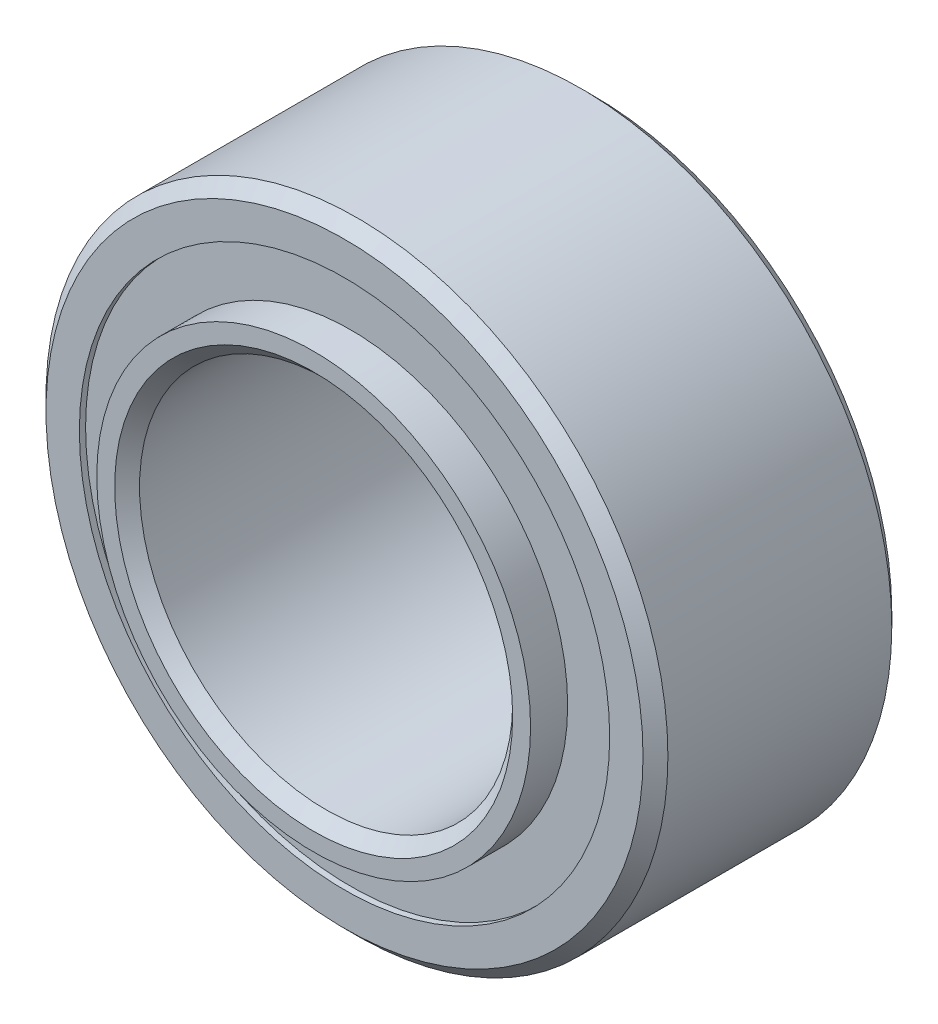
ISO-10303-21;
HEADER;
FILE_DESCRIPTION(('STEP AP214'),'2;1');
FILE_NAME('part.step','',(''),(''),'','','');
FILE_SCHEMA(('AUTOMOTIVE_DESIGN { 1 0 10303 214 1 1 1 1 }'));
ENDSEC;
DATA;
#1=APPLICATION_CONTEXT('core data for automotive mechanical design processes');
#2=APPLICATION_PROTOCOL_DEFINITION('international standard','automotive_design',2000,#1);
#3=PRODUCT_CONTEXT('',#1,'mechanical');
#4=PRODUCT('Part','Part','',(#3));
#5=PRODUCT_RELATED_PRODUCT_CATEGORY('part','',(#4));
#6=PRODUCT_DEFINITION_FORMATION('','',#4);
#7=PRODUCT_DEFINITION_CONTEXT('part definition',#1,'design');
#8=PRODUCT_DEFINITION('design','',#6,#7);
#9=PRODUCT_DEFINITION_SHAPE('','',#8);
#10=(LENGTH_UNIT() NAMED_UNIT(*) SI_UNIT(.MILLI.,.METRE.));
#11=(NAMED_UNIT(*) PLANE_ANGLE_UNIT() SI_UNIT($,.RADIAN.));
#12=(NAMED_UNIT(*) SI_UNIT($,.STERADIAN.) SOLID_ANGLE_UNIT());
#13=UNCERTAINTY_MEASURE_WITH_UNIT(LENGTH_MEASURE(1.E-05),#10,'distance_accuracy_value','');
#14=(GEOMETRIC_REPRESENTATION_CONTEXT(3) GLOBAL_UNCERTAINTY_ASSIGNED_CONTEXT((#13)) GLOBAL_UNIT_ASSIGNED_CONTEXT((#10,
#11,#12)) REPRESENTATION_CONTEXT('',''));
#15=CARTESIAN_POINT('',(0.,0.,0.));
#16=DIRECTION('',(0.,0.,1.));
#17=DIRECTION('',(1.,0.,0.));
#18=AXIS2_PLACEMENT_3D('',#15,#16,#17);
#19=CARTESIAN_POINT('',(0.,3.38434065934066,-1.508125));
#20=DIRECTION('',(0.,0.,1.));
#21=DIRECTION('',(1.,0.,0.));
#22=AXIS2_PLACEMENT_3D('',#19,#20,#21);
#23=PLANE('',#22);
#24=CARTESIAN_POINT('',(0.,0.,-1.508125));
#25=DIRECTION('',(0.,0.,1.));
#26=DIRECTION('',(1.,0.,0.));
#27=AXIS2_PLACEMENT_3D('',#24,#25,#26);
#28=CIRCLE('',#27,3.38434065934066);
#29=CARTESIAN_POINT('',(3.38434065934066,0.,-1.508125));
#30=VERTEX_POINT('',#29);
#31=EDGE_CURVE('E57',#30,#30,#28,.T.);
#32=ORIENTED_EDGE('',*,*,#31,.F.);
#33=EDGE_LOOP('',(#32));
#34=FACE_BOUND('',#33,.T.);
#35=CARTESIAN_POINT('',(0.,0.,-1.508125));
#36=DIRECTION('',(0.,0.,1.));
#37=DIRECTION('',(1.,0.,0.));
#38=AXIS2_PLACEMENT_3D('',#35,#36,#37);
#39=CIRCLE('',#38,2.7686);
#40=CARTESIAN_POINT('',(2.7686,0.,-1.508125));
#41=VERTEX_POINT('',#40);
#42=EDGE_CURVE('E11',#41,#41,#39,.T.);
#43=ORIENTED_EDGE('',*,*,#42,.T.);
#44=EDGE_LOOP('',(#43));
#45=FACE_BOUND('',#44,.T.);
#46=ADVANCED_FACE('F43',(#34,#45),#23,.F.);
#47=CARTESIAN_POINT('',(0.,0.,1.5875));
#48=DIRECTION('',(0.,0.,1.));
#49=DIRECTION('',(1.,0.,0.));
#50=AXIS2_PLACEMENT_3D('',#47,#48,#49);
#51=CYLINDRICAL_SURFACE('',#50,2.7686);
#52=ORIENTED_EDGE('',*,*,#42,.F.);
#53=EDGE_LOOP('',(#52));
#54=FACE_BOUND('',#53,.T.);
#55=CARTESIAN_POINT('',(0.,0.,-0.735956624828183));
#56=DIRECTION('',(0.,0.,1.));
#57=DIRECTION('',(1.,0.,0.));
#58=AXIS2_PLACEMENT_3D('',#55,#56,#57);
#59=CIRCLE('',#58,2.7686);
#60=CARTESIAN_POINT('',(2.7686,0.,-0.735956624828183));
#61=VERTEX_POINT('',#60);
#62=EDGE_CURVE('E49',#61,#61,#59,.T.);
#63=ORIENTED_EDGE('',*,*,#62,.T.);
#64=EDGE_LOOP('',(#63));
#65=FACE_BOUND('',#64,.T.);
#66=ADVANCED_FACE('F66',(#54,#65),#51,.F.);
#67=CARTESIAN_POINT('',(0.,3.38434065934066,-0.735956624828183));
#68=DIRECTION('',(0.,0.,-1.));
#69=DIRECTION('',(-1.,0.,0.));
#70=AXIS2_PLACEMENT_3D('',#67,#68,#69);
#71=PLANE('',#70);
#72=ORIENTED_EDGE('',*,*,#62,.F.);
#73=EDGE_LOOP('',(#72));
#74=FACE_BOUND('',#73,.T.);
#75=CARTESIAN_POINT('',(0.,0.,-0.735956624828183));
#76=DIRECTION('',(0.,0.,1.));
#77=DIRECTION('',(1.,0.,0.));
#78=AXIS2_PLACEMENT_3D('',#75,#76,#77);
#79=CIRCLE('',#78,3.38434065934066);
#80=CARTESIAN_POINT('',(3.38434065934066,0.,-0.735956624828183));
#81=VERTEX_POINT('',#80);
#82=EDGE_CURVE('E53',#81,#81,#79,.T.);
#83=ORIENTED_EDGE('',*,*,#82,.T.);
#84=EDGE_LOOP('',(#83));
#85=FACE_BOUND('',#84,.T.);
#86=ADVANCED_FACE('F70',(#74,#85),#71,.F.);
#87=CARTESIAN_POINT('',(0.,0.,1.5875));
#88=DIRECTION('',(0.,0.,1.));
#89=DIRECTION('',(1.,0.,0.));
#90=AXIS2_PLACEMENT_3D('',#87,#88,#89);
#91=CYLINDRICAL_SURFACE('',#90,3.38434065934066);
#92=ORIENTED_EDGE('',*,*,#82,.F.);
#93=EDGE_LOOP('',(#92));
#94=FACE_BOUND('',#93,.T.);
#95=ORIENTED_EDGE('',*,*,#31,.T.);
#96=EDGE_LOOP('',(#95));
#97=FACE_BOUND('',#96,.T.);
#98=ADVANCED_FACE('F63',(#94,#97),#91,.T.);
#99=CLOSED_SHELL('',(#46,#66,#86,#98));
#100=MANIFOLD_SOLID_BREP('B2',#99);
#101=CARTESIAN_POINT('',(0.,3.38434065934066,1.508125));
#102=DIRECTION('',(0.,0.,-1.));
#103=DIRECTION('',(-1.,0.,0.));
#104=AXIS2_PLACEMENT_3D('',#101,#102,#103);
#105=PLANE('',#104);
#106=CARTESIAN_POINT('',(0.,0.,1.508125));
#107=DIRECTION('',(0.,0.,1.));
#108=DIRECTION('',(1.,0.,0.));
#109=AXIS2_PLACEMENT_3D('',#106,#107,#108);
#110=CIRCLE('',#109,2.7686);
#111=CARTESIAN_POINT('',(2.7686,0.,1.508125));
#112=VERTEX_POINT('',#111);
#113=EDGE_CURVE('E42',#112,#112,#110,.T.);
#114=ORIENTED_EDGE('',*,*,#113,.F.);
#115=EDGE_LOOP('',(#114));
#116=FACE_BOUND('',#115,.T.);
#117=CARTESIAN_POINT('',(0.,0.,1.508125));
#118=DIRECTION('',(0.,0.,1.));
#119=DIRECTION('',(1.,0.,0.));
#120=AXIS2_PLACEMENT_3D('',#117,#118,#119);
#121=CIRCLE('',#120,3.38434065934066);
#122=CARTESIAN_POINT('',(3.38434065934066,0.,1.508125));
#123=VERTEX_POINT('',#122);
#124=EDGE_CURVE('E124',#123,#123,#121,.T.);
#125=ORIENTED_EDGE('',*,*,#124,.T.);
#126=EDGE_LOOP('',(#125));
#127=FACE_BOUND('',#126,.T.);
#128=ADVANCED_FACE('F110',(#116,#127),#105,.F.);
#129=CARTESIAN_POINT('',(0.,0.,1.5875));
#130=DIRECTION('',(0.,0.,1.));
#131=DIRECTION('',(1.,0.,0.));
#132=AXIS2_PLACEMENT_3D('',#129,#130,#131);
#133=CYLINDRICAL_SURFACE('',#132,2.7686);
#134=CARTESIAN_POINT('',(0.,0.,0.735956624828182));
#135=DIRECTION('',(0.,0.,1.));
#136=DIRECTION('',(1.,0.,0.));
#137=AXIS2_PLACEMENT_3D('',#134,#135,#136);
#138=CIRCLE('',#137,2.7686);
#139=CARTESIAN_POINT('',(2.7686,0.,0.735956624828182));
#140=VERTEX_POINT('',#139);
#141=EDGE_CURVE('E116',#140,#140,#138,.T.);
#142=ORIENTED_EDGE('',*,*,#141,.F.);
#143=EDGE_LOOP('',(#142));
#144=FACE_BOUND('',#143,.T.);
#145=ORIENTED_EDGE('',*,*,#113,.T.);
#146=EDGE_LOOP('',(#145));
#147=FACE_BOUND('',#146,.T.);
#148=ADVANCED_FACE('F139',(#144,#147),#133,.F.);
#149=CARTESIAN_POINT('',(0.,3.38434065934066,0.735956624828182));
#150=DIRECTION('',(0.,0.,1.));
#151=DIRECTION('',(1.,0.,0.));
#152=AXIS2_PLACEMENT_3D('',#149,#150,#151);
#153=PLANE('',#152);
#154=CARTESIAN_POINT('',(0.,0.,0.735956624828182));
#155=DIRECTION('',(0.,0.,1.));
#156=DIRECTION('',(1.,0.,0.));
#157=AXIS2_PLACEMENT_3D('',#154,#155,#156);
#158=CIRCLE('',#157,3.38434065934066);
#159=CARTESIAN_POINT('',(3.38434065934066,0.,0.735956624828182));
#160=VERTEX_POINT('',#159);
#161=EDGE_CURVE('E120',#160,#160,#158,.T.);
#162=ORIENTED_EDGE('',*,*,#161,.F.);
#163=EDGE_LOOP('',(#162));
#164=FACE_BOUND('',#163,.T.);
#165=ORIENTED_EDGE('',*,*,#141,.T.);
#166=EDGE_LOOP('',(#165));
#167=FACE_BOUND('',#166,.T.);
#168=ADVANCED_FACE('F134',(#164,#167),#153,.F.);
#169=CARTESIAN_POINT('',(0.,0.,1.5875));
#170=DIRECTION('',(0.,0.,1.));
#171=DIRECTION('',(1.,0.,0.));
#172=AXIS2_PLACEMENT_3D('',#169,#170,#171);
#173=CYLINDRICAL_SURFACE('',#172,3.38434065934066);
#174=ORIENTED_EDGE('',*,*,#124,.F.);
#175=EDGE_LOOP('',(#174));
#176=FACE_BOUND('',#175,.T.);
#177=ORIENTED_EDGE('',*,*,#161,.T.);
#178=EDGE_LOOP('',(#177));
#179=FACE_BOUND('',#178,.T.);
#180=ADVANCED_FACE('F131',(#176,#179),#173,.T.);
#181=CLOSED_SHELL('',(#128,#148,#168,#180));
#182=MANIFOLD_SOLID_BREP('B6',#181);
#183=CARTESIAN_POINT('',(-1.86621817602857,2.56862895714048,0.));
#184=DIRECTION('',(0.,0.,1.));
#185=DIRECTION('',(-0.587785252292462,0.809016994374955,0.));
#186=AXIS2_PLACEMENT_3D('',#183,#184,#185);
#187=SPHERICAL_SURFACE('',#186,0.735956624828183);
#188=CARTESIAN_POINT('',(-1.86621817602857,2.56862895714048,0.735956624828182));
#189=VERTEX_POINT('',#188);
#190=VERTEX_LOOP('',#189);
#191=FACE_BOUND('',#190,.T.);
#192=ADVANCED_FACE('F177',(#191),#187,.T.);
#193=CLOSED_SHELL('',(#192));
#194=MANIFOLD_SOLID_BREP('B37',#193);
#195=CARTESIAN_POINT('',(-3.0196044392371,0.981128957140492,0.));
#196=DIRECTION('',(0.,0.,1.));
#197=DIRECTION('',(-0.95105651629515,0.309016994374958,0.));
#198=AXIS2_PLACEMENT_3D('',#195,#196,#197);
#199=SPHERICAL_SURFACE('',#198,0.735956624828183);
#200=CARTESIAN_POINT('',(-3.0196044392371,0.981128957140492,0.735956624828182));
#201=VERTEX_POINT('',#200);
#202=VERTEX_LOOP('',#201);
#203=FACE_BOUND('',#202,.T.);
#204=ADVANCED_FACE('F197',(#203),#199,.T.);
#205=CLOSED_SHELL('',(#204));
#206=MANIFOLD_SOLID_BREP('B106',#205);
#207=CARTESIAN_POINT('',(-3.01960443923712,-0.981128957140429,0.));
#208=DIRECTION('',(0.,0.,1.));
#209=DIRECTION('',(-0.951056516295157,-0.309016994374938,0.));
#210=AXIS2_PLACEMENT_3D('',#207,#208,#209);
#211=SPHERICAL_SURFACE('',#210,0.735956624828183);
#212=CARTESIAN_POINT('',(-3.01960443923712,-0.981128957140429,0.735956624828182));
#213=VERTEX_POINT('',#212);
#214=VERTEX_LOOP('',#213);
#215=FACE_BOUND('',#214,.T.);
#216=ADVANCED_FACE('F217',(#215),#211,.T.);
#217=CLOSED_SHELL('',(#216));
#218=MANIFOLD_SOLID_BREP('B173',#217);
#219=CARTESIAN_POINT('',(-1.86621817602862,-2.56862895714044,0.));
#220=DIRECTION('',(0.,0.,1.));
#221=DIRECTION('',(-0.58778525229248,-0.809016994374942,0.));
#222=AXIS2_PLACEMENT_3D('',#219,#220,#221);
#223=SPHERICAL_SURFACE('',#222,0.735956624828183);
#224=CARTESIAN_POINT('',(-1.86621817602862,-2.56862895714044,0.735956624828182));
#225=VERTEX_POINT('',#224);
#226=VERTEX_LOOP('',#225);
#227=FACE_BOUND('',#226,.T.);
#228=ADVANCED_FACE('F237',(#227),#223,.T.);
#229=CLOSED_SHELL('',(#228));
#230=MANIFOLD_SOLID_BREP('B193',#229);
#231=CARTESIAN_POINT('',(0.,-3.175,0.));
#232=DIRECTION('',(0.,0.,1.));
#233=DIRECTION('',(0.,-1.,0.));
#234=AXIS2_PLACEMENT_3D('',#231,#232,#233);
#235=SPHERICAL_SURFACE('',#234,0.735956624828183);
#236=CARTESIAN_POINT('',(0.,-3.175,0.735956624828182));
#237=VERTEX_POINT('',#236);
#238=VERTEX_LOOP('',#237);
#239=FACE_BOUND('',#238,.T.);
#240=ADVANCED_FACE('F257',(#239),#235,.T.);
#241=CLOSED_SHELL('',(#240));
#242=MANIFOLD_SOLID_BREP('B213',#241);
#243=CARTESIAN_POINT('',(1.86621817602859,-2.56862895714047,0.));
#244=DIRECTION('',(0.,0.,1.));
#245=DIRECTION('',(0.587785252292469,-0.809016994374951,0.));
#246=AXIS2_PLACEMENT_3D('',#243,#244,#245);
#247=SPHERICAL_SURFACE('',#246,0.735956624828183);
#248=CARTESIAN_POINT('',(1.86621817602859,-2.56862895714047,0.735956624828182));
#249=VERTEX_POINT('',#248);
#250=VERTEX_LOOP('',#249);
#251=FACE_BOUND('',#250,.T.);
#252=ADVANCED_FACE('F277',(#251),#247,.T.);
#253=CLOSED_SHELL('',(#252));
#254=MANIFOLD_SOLID_BREP('B233',#253);
#255=CARTESIAN_POINT('',(3.01960443923711,-0.981128957140471,0.));
#256=DIRECTION('',(0.,0.,1.));
#257=DIRECTION('',(0.951056516295152,-0.309016994374952,0.));
#258=AXIS2_PLACEMENT_3D('',#255,#256,#257);
#259=SPHERICAL_SURFACE('',#258,0.735956624828183);
#260=CARTESIAN_POINT('',(3.01960443923711,-0.981128957140471,0.735956624828182));
#261=VERTEX_POINT('',#260);
#262=VERTEX_LOOP('',#261);
#263=FACE_BOUND('',#262,.T.);
#264=ADVANCED_FACE('F297',(#263),#259,.T.);
#265=CLOSED_SHELL('',(#264));
#266=MANIFOLD_SOLID_BREP('B253',#265);
#267=CARTESIAN_POINT('',(3.01960443923712,0.98112895714045,0.));
#268=DIRECTION('',(0.,0.,1.));
#269=DIRECTION('',(0.951056516295155,0.309016994374945,0.));
#270=AXIS2_PLACEMENT_3D('',#267,#268,#269);
#271=SPHERICAL_SURFACE('',#270,0.735956624828183);
#272=CARTESIAN_POINT('',(3.01960443923712,0.98112895714045,0.735956624828182));
#273=VERTEX_POINT('',#272);
#274=VERTEX_LOOP('',#273);
#275=FACE_BOUND('',#274,.T.);
#276=ADVANCED_FACE('F317',(#275),#271,.T.);
#277=CLOSED_SHELL('',(#276));
#278=MANIFOLD_SOLID_BREP('B273',#277);
#279=CARTESIAN_POINT('',(1.86621817602861,2.56862895714046,0.));
#280=DIRECTION('',(0.,0.,1.));
#281=DIRECTION('',(0.587785252292474,0.809016994374947,0.));
#282=AXIS2_PLACEMENT_3D('',#279,#280,#281);
#283=SPHERICAL_SURFACE('',#282,0.735956624828183);
#284=CARTESIAN_POINT('',(1.86621817602861,2.56862895714046,0.735956624828182));
#285=VERTEX_POINT('',#284);
#286=VERTEX_LOOP('',#285);
#287=FACE_BOUND('',#286,.T.);
#288=ADVANCED_FACE('F337',(#287),#283,.T.);
#289=CLOSED_SHELL('',(#288));
#290=MANIFOLD_SOLID_BREP('B293',#289);
#291=CARTESIAN_POINT('',(0.,3.175,0.));
#292=DIRECTION('',(0.,0.,1.));
#293=DIRECTION('',(0.,1.,0.));
#294=AXIS2_PLACEMENT_3D('',#291,#292,#293);
#295=SPHERICAL_SURFACE('',#294,0.735956624828183);
#296=CARTESIAN_POINT('',(0.,3.175,0.735956624828182));
#297=VERTEX_POINT('',#296);
#298=VERTEX_LOOP('',#297);
#299=FACE_BOUND('',#298,.T.);
#300=ADVANCED_FACE('F359',(#299),#295,.T.);
#301=CLOSED_SHELL('',(#300));
#302=MANIFOLD_SOLID_BREP('B313',#301);
#303=CARTESIAN_POINT('',(0.,0.,1.9812));
#304=DIRECTION('',(0.,0.,1.));
#305=DIRECTION('',(1.,0.,0.));
#306=AXIS2_PLACEMENT_3D('',#303,#304,#305);
#307=CONICAL_SURFACE('',#306,2.54,0.785398163397436);
#308=CARTESIAN_POINT('',(0.,0.,1.82245));
#309=DIRECTION('',(0.,0.,1.));
#310=DIRECTION('',(1.,0.,0.));
#311=AXIS2_PLACEMENT_3D('',#308,#309,#310);
#312=CIRCLE('',#311,2.38125);
#313=CARTESIAN_POINT('',(2.38125,0.,1.82245));
#314=VERTEX_POINT('',#313);
#315=EDGE_CURVE('E358',#314,#314,#312,.T.);
#316=ORIENTED_EDGE('',*,*,#315,.F.);
#317=EDGE_LOOP('',(#316));
#318=FACE_BOUND('',#317,.T.);
#319=CARTESIAN_POINT('',(0.,0.,1.9812));
#320=DIRECTION('',(0.,0.,1.));
#321=DIRECTION('',(1.,0.,0.));
#322=AXIS2_PLACEMENT_3D('',#319,#320,#321);
#323=CIRCLE('',#322,2.54);
#324=CARTESIAN_POINT('',(2.54,0.,1.9812));
#325=VERTEX_POINT('',#324);
#326=EDGE_CURVE('E400',#325,#325,#323,.T.);
#327=ORIENTED_EDGE('',*,*,#326,.T.);
#328=EDGE_LOOP('',(#327));
#329=FACE_BOUND('',#328,.T.);
#330=ADVANCED_FACE('F378',(#318,#329),#307,.F.);
#331=CARTESIAN_POINT('',(0.,0.,1.5875));
#332=DIRECTION('',(0.,0.,1.));
#333=DIRECTION('',(1.,0.,0.));
#334=AXIS2_PLACEMENT_3D('',#331,#332,#333);
#335=CYLINDRICAL_SURFACE('',#334,2.38125);
#336=CARTESIAN_POINT('',(0.,0.,-1.82245));
#337=DIRECTION('',(0.,0.,1.));
#338=DIRECTION('',(1.,0.,0.));
#339=AXIS2_PLACEMENT_3D('',#336,#337,#338);
#340=CIRCLE('',#339,2.38125);
#341=CARTESIAN_POINT('',(2.38125,0.,-1.82245));
#342=VERTEX_POINT('',#341);
#343=EDGE_CURVE('E384',#342,#342,#340,.T.);
#344=ORIENTED_EDGE('',*,*,#343,.F.);
#345=EDGE_LOOP('',(#344));
#346=FACE_BOUND('',#345,.T.);
#347=ORIENTED_EDGE('',*,*,#315,.T.);
#348=EDGE_LOOP('',(#347));
#349=FACE_BOUND('',#348,.T.);
#350=ADVANCED_FACE('F425',(#346,#349),#335,.F.);
#351=CARTESIAN_POINT('',(0.,0.,-1.82245));
#352=DIRECTION('',(0.,0.,-1.));
#353=DIRECTION('',(-1.,0.,0.));
#354=AXIS2_PLACEMENT_3D('',#351,#352,#353);
#355=CONICAL_SURFACE('',#354,2.38125,0.785398163397447);
#356=CARTESIAN_POINT('',(0.,0.,-1.9812));
#357=DIRECTION('',(0.,0.,1.));
#358=DIRECTION('',(1.,0.,0.));
#359=AXIS2_PLACEMENT_3D('',#356,#357,#358);
#360=CIRCLE('',#359,2.54);
#361=CARTESIAN_POINT('',(2.54,0.,-1.9812));
#362=VERTEX_POINT('',#361);
#363=EDGE_CURVE('E388',#362,#362,#360,.T.);
#364=ORIENTED_EDGE('',*,*,#363,.F.);
#365=EDGE_LOOP('',(#364));
#366=FACE_BOUND('',#365,.T.);
#367=ORIENTED_EDGE('',*,*,#343,.T.);
#368=EDGE_LOOP('',(#367));
#369=FACE_BOUND('',#368,.T.);
#370=ADVANCED_FACE('F420',(#366,#369),#355,.F.);
#371=CARTESIAN_POINT('',(0.,2.7686,-1.9812));
#372=DIRECTION('',(0.,0.,1.));
#373=DIRECTION('',(1.,0.,0.));
#374=AXIS2_PLACEMENT_3D('',#371,#372,#373);
#375=PLANE('',#374);
#376=CARTESIAN_POINT('',(0.,0.,-1.9812));
#377=DIRECTION('',(0.,0.,1.));
#378=DIRECTION('',(1.,0.,0.));
#379=AXIS2_PLACEMENT_3D('',#376,#377,#378);
#380=CIRCLE('',#379,2.7686);
#381=CARTESIAN_POINT('',(2.7686,0.,-1.9812));
#382=VERTEX_POINT('',#381);
#383=EDGE_CURVE('E392',#382,#382,#380,.T.);
#384=ORIENTED_EDGE('',*,*,#383,.F.);
#385=EDGE_LOOP('',(#384));
#386=FACE_BOUND('',#385,.T.);
#387=ORIENTED_EDGE('',*,*,#363,.T.);
#388=EDGE_LOOP('',(#387));
#389=FACE_BOUND('',#388,.T.);
#390=ADVANCED_FACE('F414',(#386,#389),#375,.F.);
#391=CARTESIAN_POINT('',(0.,0.,1.5875));
#392=DIRECTION('',(0.,0.,1.));
#393=DIRECTION('',(1.,0.,0.));
#394=AXIS2_PLACEMENT_3D('',#391,#392,#393);
#395=CYLINDRICAL_SURFACE('',#394,2.7686);
#396=CARTESIAN_POINT('',(0.,0.,1.9812));
#397=DIRECTION('',(0.,0.,1.));
#398=DIRECTION('',(1.,0.,0.));
#399=AXIS2_PLACEMENT_3D('',#396,#397,#398);
#400=CIRCLE('',#399,2.7686);
#401=CARTESIAN_POINT('',(2.7686,0.,1.9812));
#402=VERTEX_POINT('',#401);
#403=EDGE_CURVE('E397',#402,#402,#400,.T.);
#404=ORIENTED_EDGE('',*,*,#403,.F.);
#405=EDGE_LOOP('',(#404));
#406=FACE_BOUND('',#405,.T.);
#407=ORIENTED_EDGE('',*,*,#383,.T.);
#408=EDGE_LOOP('',(#407));
#409=FACE_BOUND('',#408,.T.);
#410=ADVANCED_FACE('F408',(#406,#409),#395,.T.);
#411=CARTESIAN_POINT('',(0.,2.54,1.9812));
#412=DIRECTION('',(0.,0.,-1.));
#413=DIRECTION('',(-1.,0.,0.));
#414=AXIS2_PLACEMENT_3D('',#411,#412,#413);
#415=PLANE('',#414);
#416=ORIENTED_EDGE('',*,*,#326,.F.);
#417=EDGE_LOOP('',(#416));
#418=FACE_BOUND('',#417,.T.);
#419=ORIENTED_EDGE('',*,*,#403,.T.);
#420=EDGE_LOOP('',(#419));
#421=FACE_BOUND('',#420,.T.);
#422=ADVANCED_FACE('F405',(#418,#421),#415,.F.);
#423=CLOSED_SHELL('',(#330,#350,#370,#390,#410,#422));
#424=MANIFOLD_SOLID_BREP('B333',#423);
#425=CARTESIAN_POINT('',(0.,0.,1.42875));
#426=DIRECTION('',(0.,0.,-1.));
#427=DIRECTION('',(-1.,0.,0.));
#428=AXIS2_PLACEMENT_3D('',#425,#426,#427);
#429=CONICAL_SURFACE('',#428,3.96875,0.785398163397445);
#430=CARTESIAN_POINT('',(0.,0.,1.5875));
#431=DIRECTION('',(0.,0.,1.));
#432=DIRECTION('',(1.,0.,0.));
#433=AXIS2_PLACEMENT_3D('',#430,#431,#432);
#434=CIRCLE('',#433,3.81);
#435=CARTESIAN_POINT('',(3.81,0.,1.5875));
#436=VERTEX_POINT('',#435);
#437=EDGE_CURVE('E497',#436,#436,#434,.T.);
#438=ORIENTED_EDGE('',*,*,#437,.F.);
#439=EDGE_LOOP('',(#438));
#440=FACE_BOUND('',#439,.T.);
#441=CARTESIAN_POINT('',(0.,0.,1.42875));
#442=DIRECTION('',(0.,0.,1.));
#443=DIRECTION('',(1.,0.,0.));
#444=AXIS2_PLACEMENT_3D('',#441,#442,#443);
#445=CIRCLE('',#444,3.96875);
#446=CARTESIAN_POINT('',(3.96875,0.,1.42875));
#447=VERTEX_POINT('',#446);
#448=EDGE_CURVE('E377',#447,#447,#445,.T.);
#449=ORIENTED_EDGE('',*,*,#448,.T.);
#450=EDGE_LOOP('',(#449));
#451=FACE_BOUND('',#450,.T.);
#452=ADVANCED_FACE('F469',(#440,#451),#429,.T.);
#453=CARTESIAN_POINT('',(0.,0.,1.5875));
#454=DIRECTION('',(0.,0.,1.));
#455=DIRECTION('',(1.,0.,0.));
#456=AXIS2_PLACEMENT_3D('',#453,#454,#455);
#457=CYLINDRICAL_SURFACE('',#456,3.96875);
#458=ORIENTED_EDGE('',*,*,#448,.F.);
#459=EDGE_LOOP('',(#458));
#460=FACE_BOUND('',#459,.T.);
#461=CARTESIAN_POINT('',(0.,0.,-1.42875));
#462=DIRECTION('',(0.,0.,1.));
#463=DIRECTION('',(1.,0.,0.));
#464=AXIS2_PLACEMENT_3D('',#461,#462,#463);
#465=CIRCLE('',#464,3.96875);
#466=CARTESIAN_POINT('',(3.96875,0.,-1.42875));
#467=VERTEX_POINT('',#466);
#468=EDGE_CURVE('E475',#467,#467,#465,.T.);
#469=ORIENTED_EDGE('',*,*,#468,.T.);
#470=EDGE_LOOP('',(#469));
#471=FACE_BOUND('',#470,.T.);
#472=ADVANCED_FACE('F504',(#460,#471),#457,.T.);
#473=CARTESIAN_POINT('',(0.,0.,-1.5875));
#474=DIRECTION('',(0.,0.,1.));
#475=DIRECTION('',(1.,0.,0.));
#476=AXIS2_PLACEMENT_3D('',#473,#474,#475);
#477=CONICAL_SURFACE('',#476,3.81,0.785398163397444);
#478=ORIENTED_EDGE('',*,*,#468,.F.);
#479=EDGE_LOOP('',(#478));
#480=FACE_BOUND('',#479,.T.);
#481=CARTESIAN_POINT('',(0.,0.,-1.5875));
#482=DIRECTION('',(0.,0.,1.));
#483=DIRECTION('',(1.,0.,0.));
#484=AXIS2_PLACEMENT_3D('',#481,#482,#483);
#485=CIRCLE('',#484,3.81);
#486=CARTESIAN_POINT('',(3.81,0.,-1.5875));
#487=VERTEX_POINT('',#486);
#488=EDGE_CURVE('E479',#487,#487,#485,.T.);
#489=ORIENTED_EDGE('',*,*,#488,.T.);
#490=EDGE_LOOP('',(#489));
#491=FACE_BOUND('',#490,.T.);
#492=ADVANCED_FACE('F508',(#480,#491),#477,.T.);
#493=CARTESIAN_POINT('',(0.,3.81,-1.5875));
#494=DIRECTION('',(0.,0.,1.));
#495=DIRECTION('',(1.,0.,0.));
#496=AXIS2_PLACEMENT_3D('',#493,#494,#495);
#497=PLANE('',#496);
#498=ORIENTED_EDGE('',*,*,#488,.F.);
#499=EDGE_LOOP('',(#498));
#500=FACE_BOUND('',#499,.T.);
#501=CARTESIAN_POINT('',(0.,0.,-1.5875));
#502=DIRECTION('',(0.,0.,1.));
#503=DIRECTION('',(1.,0.,0.));
#504=AXIS2_PLACEMENT_3D('',#501,#502,#503);
#505=CIRCLE('',#504,3.38434065934066);
#506=CARTESIAN_POINT('',(3.38434065934066,0.,-1.5875));
#507=VERTEX_POINT('',#506);
#508=EDGE_CURVE('E483',#507,#507,#505,.T.);
#509=ORIENTED_EDGE('',*,*,#508,.T.);
#510=EDGE_LOOP('',(#509));
#511=FACE_BOUND('',#510,.T.);
#512=ADVANCED_FACE('F513',(#500,#511),#497,.F.);
#513=CARTESIAN_POINT('',(0.,0.,1.5875));
#514=DIRECTION('',(0.,0.,1.));
#515=DIRECTION('',(1.,0.,0.));
#516=AXIS2_PLACEMENT_3D('',#513,#514,#515);
#517=CYLINDRICAL_SURFACE('',#516,3.38434065934066);
#518=ORIENTED_EDGE('',*,*,#508,.F.);
#519=EDGE_LOOP('',(#518));
#520=FACE_BOUND('',#519,.T.);
#521=CARTESIAN_POINT('',(0.,0.,-0.705555555555556));
#522=DIRECTION('',(0.,0.,1.));
#523=DIRECTION('',(1.,0.,0.));
#524=AXIS2_PLACEMENT_3D('',#521,#522,#523);
#525=CIRCLE('',#524,3.38434065934066);
#526=CARTESIAN_POINT('',(3.38434065934066,0.,-0.705555555555556));
#527=VERTEX_POINT('',#526);
#528=EDGE_CURVE('E488',#527,#527,#525,.T.);
#529=ORIENTED_EDGE('',*,*,#528,.T.);
#530=EDGE_LOOP('',(#529));
#531=FACE_BOUND('',#530,.T.);
#532=ADVANCED_FACE('F519',(#520,#531),#517,.F.);
#533=CARTESIAN_POINT('',(0.,0.,0.));
#534=DIRECTION('',(0.,0.,1.));
#535=DIRECTION('',(1.,0.,0.));
#536=AXIS2_PLACEMENT_3D('',#533,#534,#535);
#537=TOROIDAL_SURFACE('',#536,3.175,0.735956624828183);
#538=ORIENTED_EDGE('',*,*,#528,.F.);
#539=EDGE_LOOP('',(#538));
#540=FACE_BOUND('',#539,.T.);
#541=CARTESIAN_POINT('',(0.,0.,0.705555555555555));
#542=DIRECTION('',(0.,0.,1.));
#543=DIRECTION('',(1.,0.,0.));
#544=AXIS2_PLACEMENT_3D('',#541,#542,#543);
#545=CIRCLE('',#544,3.38434065934066);
#546=CARTESIAN_POINT('',(3.38434065934066,0.,0.705555555555555));
#547=VERTEX_POINT('',#546);
#548=EDGE_CURVE('E491',#547,#547,#545,.T.);
#549=ORIENTED_EDGE('',*,*,#548,.T.);
#550=EDGE_LOOP('',(#549));
#551=FACE_BOUND('',#550,.T.);
#552=ADVANCED_FACE('F523',(#540,#551),#537,.F.);
#553=CARTESIAN_POINT('',(0.,0.,1.5875));
#554=DIRECTION('',(0.,0.,1.));
#555=DIRECTION('',(1.,0.,0.));
#556=AXIS2_PLACEMENT_3D('',#553,#554,#555);
#557=CYLINDRICAL_SURFACE('',#556,3.38434065934066);
#558=ORIENTED_EDGE('',*,*,#548,.F.);
#559=EDGE_LOOP('',(#558));
#560=FACE_BOUND('',#559,.T.);
#561=CARTESIAN_POINT('',(0.,0.,1.5875));
#562=DIRECTION('',(0.,0.,1.));
#563=DIRECTION('',(1.,0.,0.));
#564=AXIS2_PLACEMENT_3D('',#561,#562,#563);
#565=CIRCLE('',#564,3.38434065934066);
#566=CARTESIAN_POINT('',(3.38434065934066,0.,1.5875));
#567=VERTEX_POINT('',#566);
#568=EDGE_CURVE('E494',#567,#567,#565,.T.);
#569=ORIENTED_EDGE('',*,*,#568,.T.);
#570=EDGE_LOOP('',(#569));
#571=FACE_BOUND('',#570,.T.);
#572=ADVANCED_FACE('F527',(#560,#571),#557,.F.);
#573=CARTESIAN_POINT('',(0.,3.81,1.5875));
#574=DIRECTION('',(0.,0.,-1.));
#575=DIRECTION('',(-1.,0.,0.));
#576=AXIS2_PLACEMENT_3D('',#573,#574,#575);
#577=PLANE('',#576);
#578=ORIENTED_EDGE('',*,*,#568,.F.);
#579=EDGE_LOOP('',(#578));
#580=FACE_BOUND('',#579,.T.);
#581=ORIENTED_EDGE('',*,*,#437,.T.);
#582=EDGE_LOOP('',(#581));
#583=FACE_BOUND('',#582,.T.);
#584=ADVANCED_FACE('F501',(#580,#583),#577,.F.);
#585=CLOSED_SHELL('',(#452,#472,#492,#512,#532,#552,#572,#584));
#586=MANIFOLD_SOLID_BREP('B353',#585);
#587=ADVANCED_BREP_SHAPE_REPRESENTATION('',(#18,#100,#182,#194,#206,#218,#230,#242,#254,#266,
#278,#290,#302,#424,#586),#14);
#588=SHAPE_DEFINITION_REPRESENTATION(#9,#587);
ENDSEC;
END-ISO-10303-21;
